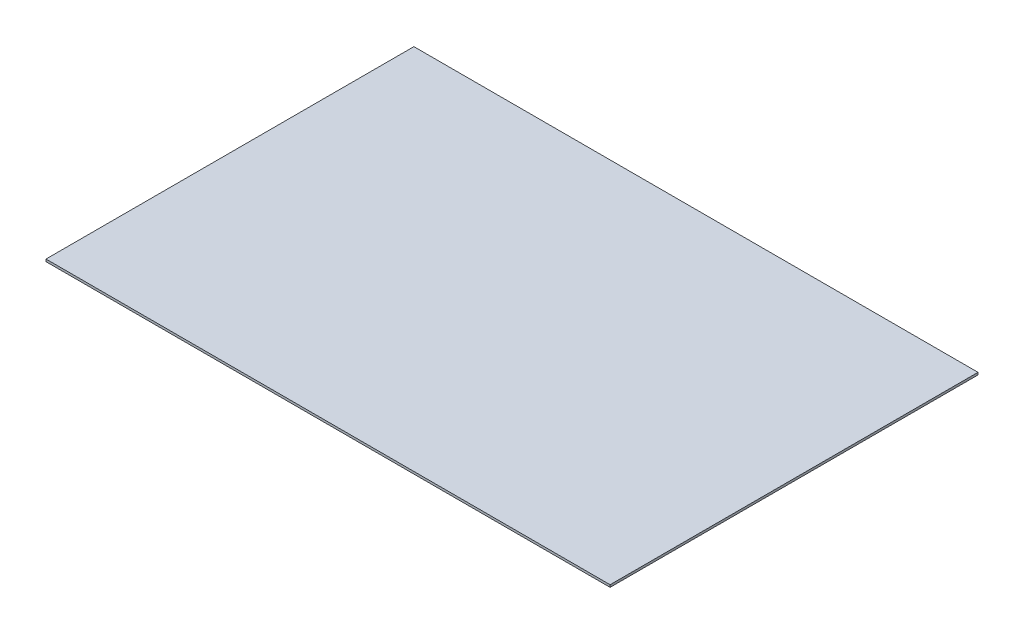
ISO-10303-21;
HEADER;
FILE_DESCRIPTION(('STEP AP214'),'2;1');
FILE_NAME('part.step','',(''),(''),'','','');
FILE_SCHEMA(('AUTOMOTIVE_DESIGN { 1 0 10303 214 1 1 1 1 }'));
ENDSEC;
DATA;
#1=APPLICATION_CONTEXT('core data for automotive mechanical design processes');
#2=APPLICATION_PROTOCOL_DEFINITION('international standard','automotive_design',2000,#1);
#3=PRODUCT_CONTEXT('',#1,'mechanical');
#4=PRODUCT('Part','Part','',(#3));
#5=PRODUCT_RELATED_PRODUCT_CATEGORY('part','',(#4));
#6=PRODUCT_DEFINITION_FORMATION('','',#4);
#7=PRODUCT_DEFINITION_CONTEXT('part definition',#1,'design');
#8=PRODUCT_DEFINITION('design','',#6,#7);
#9=PRODUCT_DEFINITION_SHAPE('','',#8);
#10=(LENGTH_UNIT() NAMED_UNIT(*) SI_UNIT(.MILLI.,.METRE.));
#11=(NAMED_UNIT(*) PLANE_ANGLE_UNIT() SI_UNIT($,.RADIAN.));
#12=(NAMED_UNIT(*) SI_UNIT($,.STERADIAN.) SOLID_ANGLE_UNIT());
#13=UNCERTAINTY_MEASURE_WITH_UNIT(LENGTH_MEASURE(1.E-05),#10,'distance_accuracy_value','');
#14=(GEOMETRIC_REPRESENTATION_CONTEXT(3) GLOBAL_UNCERTAINTY_ASSIGNED_CONTEXT((#13)) GLOBAL_UNIT_ASSIGNED_CONTEXT((#10,
#11,#12)) REPRESENTATION_CONTEXT('',''));
#15=CARTESIAN_POINT('',(0.,0.,0.));
#16=DIRECTION('',(0.,0.,1.));
#17=DIRECTION('',(1.,0.,0.));
#18=AXIS2_PLACEMENT_3D('',#15,#16,#17);
#19=CARTESIAN_POINT('',(584.2,4.7625,-381.));
#20=DIRECTION('',(-1.,0.,0.));
#21=DIRECTION('',(0.,0.,1.));
#22=AXIS2_PLACEMENT_3D('',#19,#20,#21);
#23=PLANE('',#22);
#24=DIRECTION('',(0.,0.,-1.));
#25=VECTOR('',#24,1.);
#26=CARTESIAN_POINT('',(584.2,0.,-381.));
#27=LINE('',#26,#25);
#28=CARTESIAN_POINT('',(584.2,0.,381.));
#29=VERTEX_POINT('',#28);
#30=CARTESIAN_POINT('',(584.2,0.,-381.));
#31=VERTEX_POINT('',#30);
#32=EDGE_CURVE('E100',#29,#31,#27,.T.);
#33=ORIENTED_EDGE('',*,*,#32,.T.);
#34=DIRECTION('',(0.,-1.,0.));
#35=VECTOR('',#34,1.);
#36=CARTESIAN_POINT('',(584.2,4.7625,-381.));
#37=LINE('',#36,#35);
#38=CARTESIAN_POINT('',(584.2,4.7625,-381.));
#39=VERTEX_POINT('',#38);
#40=EDGE_CURVE('E11',#39,#31,#37,.T.);
#41=ORIENTED_EDGE('',*,*,#40,.F.);
#42=DIRECTION('',(0.,0.,-1.));
#43=VECTOR('',#42,1.);
#44=CARTESIAN_POINT('',(584.2,4.7625,-381.));
#45=LINE('',#44,#43);
#46=CARTESIAN_POINT('',(584.2,4.7625,381.));
#47=VERTEX_POINT('',#46);
#48=EDGE_CURVE('E88',#47,#39,#45,.T.);
#49=ORIENTED_EDGE('',*,*,#48,.F.);
#50=DIRECTION('',(0.,-1.,0.));
#51=VECTOR('',#50,1.);
#52=CARTESIAN_POINT('',(584.2,4.7625,381.));
#53=LINE('',#52,#51);
#54=EDGE_CURVE('E96',#47,#29,#53,.T.);
#55=ORIENTED_EDGE('',*,*,#54,.T.);
#56=EDGE_LOOP('',(#33,#41,#49,#55));
#57=FACE_BOUND('',#56,.T.);
#58=ADVANCED_FACE('F37',(#57),#23,.F.);
#59=CARTESIAN_POINT('',(-584.2,4.7625,-381.));
#60=DIRECTION('',(0.,0.,1.));
#61=DIRECTION('',(1.,0.,0.));
#62=AXIS2_PLACEMENT_3D('',#59,#60,#61);
#63=PLANE('',#62);
#64=DIRECTION('',(-1.,0.,0.));
#65=VECTOR('',#64,1.);
#66=CARTESIAN_POINT('',(-584.2,0.,-381.));
#67=LINE('',#66,#65);
#68=CARTESIAN_POINT('',(-584.2,0.,-381.));
#69=VERTEX_POINT('',#68);
#70=EDGE_CURVE('E92',#31,#69,#67,.T.);
#71=ORIENTED_EDGE('',*,*,#70,.T.);
#72=DIRECTION('',(0.,-1.,0.));
#73=VECTOR('',#72,1.);
#74=CARTESIAN_POINT('',(-584.2,4.7625,-381.));
#75=LINE('',#74,#73);
#76=CARTESIAN_POINT('',(-584.2,4.7625,-381.));
#77=VERTEX_POINT('',#76);
#78=EDGE_CURVE('E45',#77,#69,#75,.T.);
#79=ORIENTED_EDGE('',*,*,#78,.F.);
#80=DIRECTION('',(-1.,0.,0.));
#81=VECTOR('',#80,1.);
#82=CARTESIAN_POINT('',(-584.2,4.7625,-381.));
#83=LINE('',#82,#81);
#84=EDGE_CURVE('E83',#39,#77,#83,.T.);
#85=ORIENTED_EDGE('',*,*,#84,.F.);
#86=ORIENTED_EDGE('',*,*,#40,.T.);
#87=EDGE_LOOP('',(#71,#79,#85,#86));
#88=FACE_BOUND('',#87,.T.);
#89=ADVANCED_FACE('F91',(#88),#63,.F.);
#90=CARTESIAN_POINT('',(-584.2,4.7625,-381.));
#91=DIRECTION('',(1.,0.,0.));
#92=DIRECTION('',(0.,0.,-1.));
#93=AXIS2_PLACEMENT_3D('',#90,#91,#92);
#94=PLANE('',#93);
#95=DIRECTION('',(0.,0.,1.));
#96=VECTOR('',#95,1.);
#97=CARTESIAN_POINT('',(-584.2,0.,-381.));
#98=LINE('',#97,#96);
#99=CARTESIAN_POINT('',(-584.2,0.,381.));
#100=VERTEX_POINT('',#99);
#101=EDGE_CURVE('E70',#69,#100,#98,.T.);
#102=ORIENTED_EDGE('',*,*,#101,.T.);
#103=DIRECTION('',(0.,-1.,0.));
#104=VECTOR('',#103,1.);
#105=CARTESIAN_POINT('',(-584.2,4.7625,381.));
#106=LINE('',#105,#104);
#107=CARTESIAN_POINT('',(-584.2,4.7625,381.));
#108=VERTEX_POINT('',#107);
#109=EDGE_CURVE('E93',#108,#100,#106,.T.);
#110=ORIENTED_EDGE('',*,*,#109,.F.);
#111=DIRECTION('',(0.,0.,1.));
#112=VECTOR('',#111,1.);
#113=CARTESIAN_POINT('',(-584.2,4.7625,-381.));
#114=LINE('',#113,#112);
#115=EDGE_CURVE('E86',#77,#108,#114,.T.);
#116=ORIENTED_EDGE('',*,*,#115,.F.);
#117=ORIENTED_EDGE('',*,*,#78,.T.);
#118=EDGE_LOOP('',(#102,#110,#116,#117));
#119=FACE_BOUND('',#118,.T.);
#120=ADVANCED_FACE('F94',(#119),#94,.F.);
#121=CARTESIAN_POINT('',(-584.2,4.7625,381.));
#122=DIRECTION('',(0.,0.,-1.));
#123=DIRECTION('',(-1.,0.,0.));
#124=AXIS2_PLACEMENT_3D('',#121,#122,#123);
#125=PLANE('',#124);
#126=DIRECTION('',(1.,0.,0.));
#127=VECTOR('',#126,1.);
#128=CARTESIAN_POINT('',(-584.2,0.,381.));
#129=LINE('',#128,#127);
#130=EDGE_CURVE('E76',#100,#29,#129,.T.);
#131=ORIENTED_EDGE('',*,*,#130,.T.);
#132=ORIENTED_EDGE('',*,*,#54,.F.);
#133=DIRECTION('',(1.,0.,0.));
#134=VECTOR('',#133,1.);
#135=CARTESIAN_POINT('',(-584.2,4.7625,381.));
#136=LINE('',#135,#134);
#137=EDGE_CURVE('E53',#108,#47,#136,.T.);
#138=ORIENTED_EDGE('',*,*,#137,.F.);
#139=ORIENTED_EDGE('',*,*,#109,.T.);
#140=EDGE_LOOP('',(#131,#132,#138,#139));
#141=FACE_BOUND('',#140,.T.);
#142=ADVANCED_FACE('F107',(#141),#125,.F.);
#143=CARTESIAN_POINT('',(0.,4.7625,0.));
#144=DIRECTION('',(0.,1.,0.));
#145=DIRECTION('',(0.,0.,1.));
#146=AXIS2_PLACEMENT_3D('',#143,#144,#145);
#147=PLANE('',#146);
#148=ORIENTED_EDGE('',*,*,#48,.T.);
#149=ORIENTED_EDGE('',*,*,#84,.T.);
#150=ORIENTED_EDGE('',*,*,#115,.T.);
#151=ORIENTED_EDGE('',*,*,#137,.T.);
#152=EDGE_LOOP('',(#148,#149,#150,#151));
#153=FACE_BOUND('',#152,.T.);
#154=ADVANCED_FACE('F84',(#153),#147,.T.);
#155=CARTESIAN_POINT('',(0.,0.,0.));
#156=DIRECTION('',(0.,1.,0.));
#157=DIRECTION('',(0.,0.,1.));
#158=AXIS2_PLACEMENT_3D('',#155,#156,#157);
#159=PLANE('',#158);
#160=ORIENTED_EDGE('',*,*,#32,.F.);
#161=ORIENTED_EDGE('',*,*,#130,.F.);
#162=ORIENTED_EDGE('',*,*,#101,.F.);
#163=ORIENTED_EDGE('',*,*,#70,.F.);
#164=EDGE_LOOP('',(#160,#161,#162,#163));
#165=FACE_BOUND('',#164,.T.);
#166=ADVANCED_FACE('F110',(#165),#159,.F.);
#167=CLOSED_SHELL('',(#58,#89,#120,#142,#154,#166));
#168=MANIFOLD_SOLID_BREP('B2',#167);
#169=ADVANCED_BREP_SHAPE_REPRESENTATION('',(#18,#168),#14);
#170=SHAPE_DEFINITION_REPRESENTATION(#9,#169);
ENDSEC;
END-ISO-10303-21;
